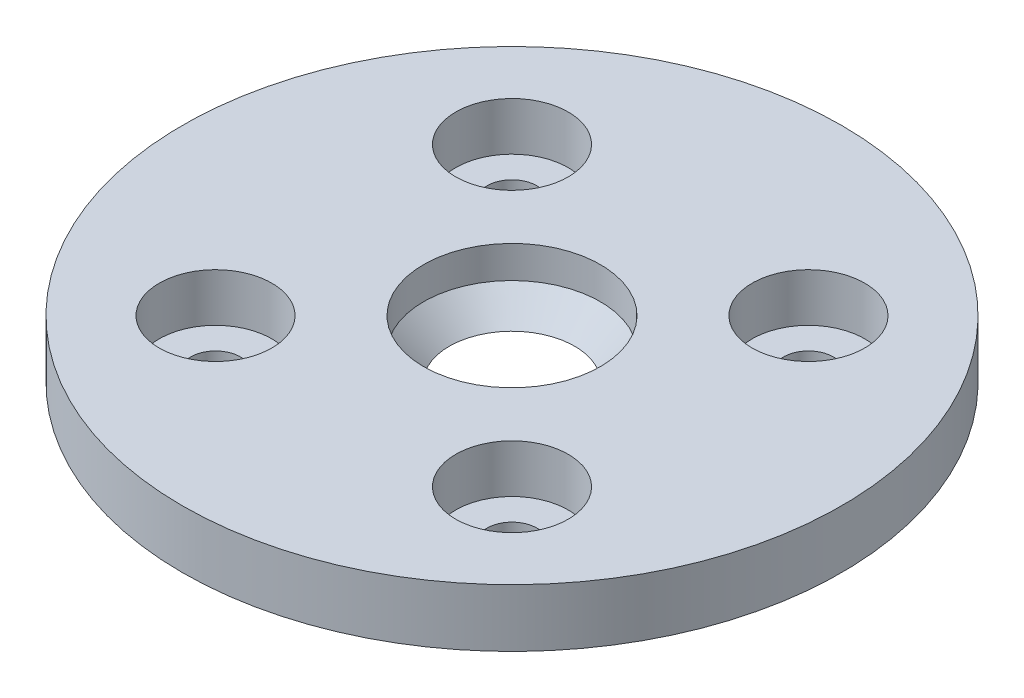
ISO-10303-21;
HEADER;
FILE_DESCRIPTION(('STEP AP214'),'2;1');
FILE_NAME('part.step','',(''),(''),'','','');
FILE_SCHEMA(('AUTOMOTIVE_DESIGN { 1 0 10303 214 1 1 1 1 }'));
ENDSEC;
DATA;
#1=APPLICATION_CONTEXT('core data for automotive mechanical design processes');
#2=APPLICATION_PROTOCOL_DEFINITION('international standard','automotive_design',2000,#1);
#3=PRODUCT_CONTEXT('',#1,'mechanical');
#4=PRODUCT('Part','Part','',(#3));
#5=PRODUCT_RELATED_PRODUCT_CATEGORY('part','',(#4));
#6=PRODUCT_DEFINITION_FORMATION('','',#4);
#7=PRODUCT_DEFINITION_CONTEXT('part definition',#1,'design');
#8=PRODUCT_DEFINITION('design','',#6,#7);
#9=PRODUCT_DEFINITION_SHAPE('','',#8);
#10=(LENGTH_UNIT() NAMED_UNIT(*) SI_UNIT(.MILLI.,.METRE.));
#11=(NAMED_UNIT(*) PLANE_ANGLE_UNIT() SI_UNIT($,.RADIAN.));
#12=(NAMED_UNIT(*) SI_UNIT($,.STERADIAN.) SOLID_ANGLE_UNIT());
#13=UNCERTAINTY_MEASURE_WITH_UNIT(LENGTH_MEASURE(1.E-05),#10,'distance_accuracy_value','');
#14=(GEOMETRIC_REPRESENTATION_CONTEXT(3) GLOBAL_UNCERTAINTY_ASSIGNED_CONTEXT((#13)) GLOBAL_UNIT_ASSIGNED_CONTEXT((#10,
#11,#12)) REPRESENTATION_CONTEXT('',''));
#15=CARTESIAN_POINT('',(0.,0.,0.));
#16=DIRECTION('',(0.,0.,1.));
#17=DIRECTION('',(1.,0.,0.));
#18=AXIS2_PLACEMENT_3D('',#15,#16,#17);
#19=CARTESIAN_POINT('',(0.,0.8,0.));
#20=DIRECTION('',(0.,-1.,0.));
#21=DIRECTION('',(0.,0.,-1.));
#22=AXIS2_PLACEMENT_3D('',#19,#20,#21);
#23=CYLINDRICAL_SURFACE('',#22,10.25);
#24=CARTESIAN_POINT('',(0.,0.,0.));
#25=DIRECTION('',(0.,1.,0.));
#26=DIRECTION('',(0.,0.,1.));
#27=AXIS2_PLACEMENT_3D('',#24,#25,#26);
#28=CIRCLE('',#27,10.25);
#29=CARTESIAN_POINT('',(0.,0.,10.25));
#30=VERTEX_POINT('',#29);
#31=EDGE_CURVE('E11',#30,#30,#28,.T.);
#32=ORIENTED_EDGE('',*,*,#31,.T.);
#33=EDGE_LOOP('',(#32));
#34=FACE_BOUND('',#33,.T.);
#35=CARTESIAN_POINT('',(0.,1.8,0.));
#36=DIRECTION('',(0.,1.,0.));
#37=DIRECTION('',(0.,0.,1.));
#38=AXIS2_PLACEMENT_3D('',#35,#36,#37);
#39=CIRCLE('',#38,10.25);
#40=CARTESIAN_POINT('',(0.,1.8,10.25));
#41=VERTEX_POINT('',#40);
#42=EDGE_CURVE('E300',#41,#41,#39,.T.);
#43=ORIENTED_EDGE('',*,*,#42,.F.);
#44=EDGE_LOOP('',(#43));
#45=FACE_BOUND('',#44,.T.);
#46=ADVANCED_FACE('F36',(#34,#45),#23,.T.);
#47=CARTESIAN_POINT('',(0.,0.,0.));
#48=DIRECTION('',(0.,1.,0.));
#49=DIRECTION('',(0.,0.,1.));
#50=AXIS2_PLACEMENT_3D('',#47,#48,#49);
#51=PLANE('',#50);
#52=DIRECTION('',(0.422618261740701,0.,0.906307787036649));
#53=VECTOR('',#52,1.);
#54=CARTESIAN_POINT('',(2.32440043957385,0.,4.98469282870157));
#55=LINE('',#54,#53);
#56=CARTESIAN_POINT('',(2.32440043957385,0.,4.98469282870157));
#57=VERTEX_POINT('',#56);
#58=CARTESIAN_POINT('',(3.80356435566631,0.,8.15677008332985));
#59=VERTEX_POINT('',#58);
#60=EDGE_CURVE('E179',#57,#59,#55,.T.);
#61=ORIENTED_EDGE('',*,*,#60,.F.);
#62=CARTESIAN_POINT('',(0.,0.,0.));
#63=DIRECTION('',(0.,1.,0.));
#64=DIRECTION('',(0.,0.,-1.));
#65=AXIS2_PLACEMENT_3D('',#62,#63,#64);
#66=CIRCLE('',#65,5.5);
#67=CARTESIAN_POINT('',(-2.32440043957382,0.,4.98469282870159));
#68=VERTEX_POINT('',#67);
#69=EDGE_CURVE('E52',#68,#57,#66,.T.);
#70=ORIENTED_EDGE('',*,*,#69,.F.);
#71=DIRECTION('',(0.422618261740694,0.,-0.906307787036652));
#72=VECTOR('',#71,1.);
#73=CARTESIAN_POINT('',(-2.32440043957382,0.,4.98469282870159));
#74=LINE('',#73,#72);
#75=CARTESIAN_POINT('',(-3.80356435566625,0.,8.15677008332987));
#76=VERTEX_POINT('',#75);
#77=EDGE_CURVE('E170',#76,#68,#74,.T.);
#78=ORIENTED_EDGE('',*,*,#77,.F.);
#79=CARTESIAN_POINT('',(0.,0.,0.));
#80=DIRECTION('',(0.,-1.,0.));
#81=DIRECTION('',(0.,0.,-1.));
#82=AXIS2_PLACEMENT_3D('',#79,#80,#81);
#83=CIRCLE('',#82,9.);
#84=EDGE_CURVE('E173',#59,#76,#83,.T.);
#85=ORIENTED_EDGE('',*,*,#84,.F.);
#86=EDGE_LOOP('',(#61,#70,#78,#85));
#87=FACE_BOUND('',#86,.T.);
#88=DIRECTION('',(-0.90630778703665,0.,0.4226182617407));
#89=VECTOR('',#88,1.);
#90=CARTESIAN_POINT('',(-4.98469282870157,0.,2.32440043957385));
#91=LINE('',#90,#89);
#92=CARTESIAN_POINT('',(-4.98469282870157,0.,2.32440043957385));
#93=VERTEX_POINT('',#92);
#94=CARTESIAN_POINT('',(-8.15677008332985,0.,3.8035643556663));
#95=VERTEX_POINT('',#94);
#96=EDGE_CURVE('E205',#93,#95,#91,.T.);
#97=ORIENTED_EDGE('',*,*,#96,.F.);
#98=CARTESIAN_POINT('',(0.,0.,0.));
#99=DIRECTION('',(0.,1.,0.));
#100=DIRECTION('',(0.,0.,-1.));
#101=AXIS2_PLACEMENT_3D('',#98,#99,#100);
#102=CIRCLE('',#101,5.5);
#103=CARTESIAN_POINT('',(-4.98469282870159,0.,-2.32440043957381));
#104=VERTEX_POINT('',#103);
#105=EDGE_CURVE('E60',#104,#93,#102,.T.);
#106=ORIENTED_EDGE('',*,*,#105,.F.);
#107=DIRECTION('',(0.906307787036653,0.,0.422618261740692));
#108=VECTOR('',#107,1.);
#109=CARTESIAN_POINT('',(-4.98469282870159,0.,-2.32440043957381));
#110=LINE('',#109,#108);
#111=CARTESIAN_POINT('',(-8.15677008332988,0.,-3.80356435566623));
#112=VERTEX_POINT('',#111);
#113=EDGE_CURVE('E194',#112,#104,#110,.T.);
#114=ORIENTED_EDGE('',*,*,#113,.F.);
#115=CARTESIAN_POINT('',(0.,0.,0.));
#116=DIRECTION('',(0.,-1.,0.));
#117=DIRECTION('',(0.,0.,-1.));
#118=AXIS2_PLACEMENT_3D('',#115,#116,#117);
#119=CIRCLE('',#118,9.);
#120=EDGE_CURVE('E209',#95,#112,#119,.T.);
#121=ORIENTED_EDGE('',*,*,#120,.F.);
#122=EDGE_LOOP('',(#97,#106,#114,#121));
#123=FACE_BOUND('',#122,.T.);
#124=DIRECTION('',(-0.422618261740693,0.,0.906307787036653));
#125=VECTOR('',#124,1.);
#126=CARTESIAN_POINT('',(2.32440043957381,0.,-4.98469282870159));
#127=LINE('',#126,#125);
#128=CARTESIAN_POINT('',(3.80356435566623,0.,-8.15677008332988));
#129=VERTEX_POINT('',#128);
#130=CARTESIAN_POINT('',(2.32440043957381,0.,-4.98469282870159));
#131=VERTEX_POINT('',#130);
#132=EDGE_CURVE('E236',#129,#131,#127,.T.);
#133=ORIENTED_EDGE('',*,*,#132,.F.);
#134=CARTESIAN_POINT('',(0.,0.,0.));
#135=DIRECTION('',(0.,-1.,0.));
#136=DIRECTION('',(0.,0.,-1.));
#137=AXIS2_PLACEMENT_3D('',#134,#135,#136);
#138=CIRCLE('',#137,9.);
#139=CARTESIAN_POINT('',(-3.8035643556663,0.,-8.15677008332985));
#140=VERTEX_POINT('',#139);
#141=EDGE_CURVE('E234',#140,#129,#138,.T.);
#142=ORIENTED_EDGE('',*,*,#141,.F.);
#143=DIRECTION('',(-0.4226182617407,0.,-0.90630778703665));
#144=VECTOR('',#143,1.);
#145=CARTESIAN_POINT('',(-2.32440043957385,0.,-4.98469282870157));
#146=LINE('',#145,#144);
#147=CARTESIAN_POINT('',(-2.32440043957385,0.,-4.98469282870157));
#148=VERTEX_POINT('',#147);
#149=EDGE_CURVE('E224',#148,#140,#146,.T.);
#150=ORIENTED_EDGE('',*,*,#149,.F.);
#151=CARTESIAN_POINT('',(0.,0.,0.));
#152=DIRECTION('',(0.,1.,0.));
#153=DIRECTION('',(0.,0.,-1.));
#154=AXIS2_PLACEMENT_3D('',#151,#152,#153);
#155=CIRCLE('',#154,5.5);
#156=EDGE_CURVE('E240',#131,#148,#155,.T.);
#157=ORIENTED_EDGE('',*,*,#156,.F.);
#158=EDGE_LOOP('',(#133,#142,#150,#157));
#159=FACE_BOUND('',#158,.T.);
#160=DIRECTION('',(-0.906307787036653,0.,-0.422618261740693));
#161=VECTOR('',#160,1.);
#162=CARTESIAN_POINT('',(4.98469282870159,0.,2.32440043957381));
#163=LINE('',#162,#161);
#164=CARTESIAN_POINT('',(8.15677008332987,0.,3.80356435566624));
#165=VERTEX_POINT('',#164);
#166=CARTESIAN_POINT('',(4.98469282870159,0.,2.32440043957381));
#167=VERTEX_POINT('',#166);
#168=EDGE_CURVE('E268',#165,#167,#163,.T.);
#169=ORIENTED_EDGE('',*,*,#168,.F.);
#170=CARTESIAN_POINT('',(0.,0.,0.));
#171=DIRECTION('',(0.,-1.,0.));
#172=DIRECTION('',(0.,0.,-1.));
#173=AXIS2_PLACEMENT_3D('',#170,#171,#172);
#174=CIRCLE('',#173,9.);
#175=CARTESIAN_POINT('',(8.15677008332985,0.,-3.80356435566629));
#176=VERTEX_POINT('',#175);
#177=EDGE_CURVE('E266',#176,#165,#174,.T.);
#178=ORIENTED_EDGE('',*,*,#177,.F.);
#179=DIRECTION('',(0.90630778703665,0.,-0.422618261740699));
#180=VECTOR('',#179,1.);
#181=CARTESIAN_POINT('',(4.98469282870157,0.,-2.32440043957384));
#182=LINE('',#181,#180);
#183=CARTESIAN_POINT('',(4.98469282870158,0.,-2.32440043957384));
#184=VERTEX_POINT('',#183);
#185=EDGE_CURVE('E256',#184,#176,#182,.T.);
#186=ORIENTED_EDGE('',*,*,#185,.F.);
#187=CARTESIAN_POINT('',(0.,0.,0.));
#188=DIRECTION('',(0.,1.,0.));
#189=DIRECTION('',(0.,0.,-1.));
#190=AXIS2_PLACEMENT_3D('',#187,#188,#189);
#191=CIRCLE('',#190,5.5);
#192=EDGE_CURVE('E271',#167,#184,#191,.T.);
#193=ORIENTED_EDGE('',*,*,#192,.F.);
#194=EDGE_LOOP('',(#169,#178,#186,#193));
#195=FACE_BOUND('',#194,.T.);
#196=CARTESIAN_POINT('',(-4.61033621333629,0.,-4.61033621333629));
#197=DIRECTION('',(0.,1.,0.));
#198=DIRECTION('',(0.,0.,1.));
#199=AXIS2_PLACEMENT_3D('',#196,#197,#198);
#200=CIRCLE('',#199,0.775);
#201=CARTESIAN_POINT('',(-4.61033621333629,0.,-3.83533621333629));
#202=VERTEX_POINT('',#201);
#203=EDGE_CURVE('E39',#202,#202,#200,.T.);
#204=ORIENTED_EDGE('',*,*,#203,.T.);
#205=EDGE_LOOP('',(#204));
#206=FACE_BOUND('',#205,.T.);
#207=CARTESIAN_POINT('',(4.61033621333629,0.,4.61033621333629));
#208=DIRECTION('',(0.,1.,0.));
#209=DIRECTION('',(0.,0.,1.));
#210=AXIS2_PLACEMENT_3D('',#207,#208,#209);
#211=CIRCLE('',#210,0.775);
#212=CARTESIAN_POINT('',(4.61033621333629,0.,5.38533621333629));
#213=VERTEX_POINT('',#212);
#214=EDGE_CURVE('E334',#213,#213,#211,.T.);
#215=ORIENTED_EDGE('',*,*,#214,.T.);
#216=EDGE_LOOP('',(#215));
#217=FACE_BOUND('',#216,.T.);
#218=CARTESIAN_POINT('',(4.61033621333629,0.,-4.61033621333629));
#219=DIRECTION('',(0.,1.,0.));
#220=DIRECTION('',(0.,0.,1.));
#221=AXIS2_PLACEMENT_3D('',#218,#219,#220);
#222=CIRCLE('',#221,0.775);
#223=CARTESIAN_POINT('',(4.61033621333629,0.,-3.83533621333629));
#224=VERTEX_POINT('',#223);
#225=EDGE_CURVE('E332',#224,#224,#222,.T.);
#226=ORIENTED_EDGE('',*,*,#225,.T.);
#227=EDGE_LOOP('',(#226));
#228=FACE_BOUND('',#227,.T.);
#229=CARTESIAN_POINT('',(-4.61033621333629,0.,4.61033621333629));
#230=DIRECTION('',(0.,1.,0.));
#231=DIRECTION('',(0.,0.,1.));
#232=AXIS2_PLACEMENT_3D('',#229,#230,#231);
#233=CIRCLE('',#232,0.775);
#234=CARTESIAN_POINT('',(-4.61033621333629,0.,5.38533621333629));
#235=VERTEX_POINT('',#234);
#236=EDGE_CURVE('E315',#235,#235,#233,.T.);
#237=ORIENTED_EDGE('',*,*,#236,.T.);
#238=EDGE_LOOP('',(#237));
#239=FACE_BOUND('',#238,.T.);
#240=CARTESIAN_POINT('',(0.,0.,0.));
#241=DIRECTION('',(0.,1.,0.));
#242=DIRECTION('',(0.,0.,1.));
#243=AXIS2_PLACEMENT_3D('',#240,#241,#242);
#244=CIRCLE('',#243,1.95);
#245=CARTESIAN_POINT('',(0.,0.,1.95));
#246=VERTEX_POINT('',#245);
#247=EDGE_CURVE('E44',#246,#246,#244,.T.);
#248=ORIENTED_EDGE('',*,*,#247,.T.);
#249=EDGE_LOOP('',(#248));
#250=FACE_BOUND('',#249,.T.);
#251=ORIENTED_EDGE('',*,*,#31,.F.);
#252=EDGE_LOOP('',(#251));
#253=FACE_BOUND('',#252,.T.);
#254=ADVANCED_FACE('F341',(#87,#123,#159,#195,#206,#217,#228,#239,#250,#253),#51,.F.);
#255=CARTESIAN_POINT('',(0.,0.8,0.));
#256=DIRECTION('',(0.,1.,0.));
#257=DIRECTION('',(0.,0.,1.));
#258=AXIS2_PLACEMENT_3D('',#255,#256,#257);
#259=CONICAL_SURFACE('',#258,2.75,0.785398163397449);
#260=CARTESIAN_POINT('',(0.,0.8,0.));
#261=DIRECTION('',(0.,1.,0.));
#262=DIRECTION('',(0.,0.,1.));
#263=AXIS2_PLACEMENT_3D('',#260,#261,#262);
#264=CIRCLE('',#263,2.75);
#265=CARTESIAN_POINT('',(0.,0.8,2.75));
#266=VERTEX_POINT('',#265);
#267=EDGE_CURVE('E291',#266,#266,#264,.T.);
#268=ORIENTED_EDGE('',*,*,#267,.T.);
#269=EDGE_LOOP('',(#268));
#270=FACE_BOUND('',#269,.T.);
#271=ORIENTED_EDGE('',*,*,#247,.F.);
#272=EDGE_LOOP('',(#271));
#273=FACE_BOUND('',#272,.T.);
#274=ADVANCED_FACE('F365',(#270,#273),#259,.F.);
#275=CARTESIAN_POINT('',(-4.61033621333629,0.3,4.61033621333629));
#276=DIRECTION('',(0.,1.,0.));
#277=DIRECTION('',(0.,0.,1.));
#278=AXIS2_PLACEMENT_3D('',#275,#276,#277);
#279=CYLINDRICAL_SURFACE('',#278,1.75);
#280=CARTESIAN_POINT('',(-4.61033621333629,0.3,4.61033621333629));
#281=DIRECTION('',(0.,1.,0.));
#282=DIRECTION('',(0.,0.,1.));
#283=AXIS2_PLACEMENT_3D('',#280,#281,#282);
#284=CIRCLE('',#283,1.75);
#285=CARTESIAN_POINT('',(-4.61033621333629,0.3,6.36033621333629));
#286=VERTEX_POINT('',#285);
#287=EDGE_CURVE('E319',#286,#286,#284,.T.);
#288=ORIENTED_EDGE('',*,*,#287,.F.);
#289=EDGE_LOOP('',(#288));
#290=FACE_BOUND('',#289,.T.);
#291=CARTESIAN_POINT('',(-4.61033621333629,1.8,4.61033621333629));
#292=DIRECTION('',(0.,1.,0.));
#293=DIRECTION('',(0.,0.,1.));
#294=AXIS2_PLACEMENT_3D('',#291,#292,#293);
#295=CIRCLE('',#294,1.75);
#296=CARTESIAN_POINT('',(-4.61033621333629,1.8,6.36033621333629));
#297=VERTEX_POINT('',#296);
#298=EDGE_CURVE('E288',#297,#297,#295,.T.);
#299=ORIENTED_EDGE('',*,*,#298,.T.);
#300=EDGE_LOOP('',(#299));
#301=FACE_BOUND('',#300,.T.);
#302=ADVANCED_FACE('F401',(#290,#301),#279,.F.);
#303=CARTESIAN_POINT('',(-4.61033621333629,0.3,4.61033621333629));
#304=DIRECTION('',(0.,1.,0.));
#305=DIRECTION('',(0.,0.,1.));
#306=AXIS2_PLACEMENT_3D('',#303,#304,#305);
#307=PLANE('',#306);
#308=CARTESIAN_POINT('',(-4.61033621333629,0.3,4.61033621333629));
#309=DIRECTION('',(0.,1.,0.));
#310=DIRECTION('',(0.,0.,1.));
#311=AXIS2_PLACEMENT_3D('',#308,#309,#310);
#312=CIRCLE('',#311,0.775);
#313=CARTESIAN_POINT('',(-4.61033621333629,0.3,5.38533621333629));
#314=VERTEX_POINT('',#313);
#315=EDGE_CURVE('E307',#314,#314,#312,.T.);
#316=ORIENTED_EDGE('',*,*,#315,.F.);
#317=EDGE_LOOP('',(#316));
#318=FACE_BOUND('',#317,.T.);
#319=ORIENTED_EDGE('',*,*,#287,.T.);
#320=EDGE_LOOP('',(#319));
#321=FACE_BOUND('',#320,.T.);
#322=ADVANCED_FACE('F397',(#318,#321),#307,.T.);
#323=CARTESIAN_POINT('',(4.61033621333629,0.3,-4.61033621333629));
#324=DIRECTION('',(0.,1.,0.));
#325=DIRECTION('',(0.,0.,1.));
#326=AXIS2_PLACEMENT_3D('',#323,#324,#325);
#327=CYLINDRICAL_SURFACE('',#326,1.75);
#328=CARTESIAN_POINT('',(4.61033621333629,0.3,-4.61033621333629));
#329=DIRECTION('',(0.,1.,0.));
#330=DIRECTION('',(0.,0.,1.));
#331=AXIS2_PLACEMENT_3D('',#328,#329,#330);
#332=CIRCLE('',#331,1.75);
#333=CARTESIAN_POINT('',(4.61033621333629,0.3,-2.86033621333629));
#334=VERTEX_POINT('',#333);
#335=EDGE_CURVE('E316',#334,#334,#332,.T.);
#336=ORIENTED_EDGE('',*,*,#335,.F.);
#337=EDGE_LOOP('',(#336));
#338=FACE_BOUND('',#337,.T.);
#339=CARTESIAN_POINT('',(4.61033621333629,1.8,-4.61033621333629));
#340=DIRECTION('',(0.,1.,0.));
#341=DIRECTION('',(0.,0.,1.));
#342=AXIS2_PLACEMENT_3D('',#339,#340,#341);
#343=CIRCLE('',#342,1.75);
#344=CARTESIAN_POINT('',(4.61033621333629,1.8,-2.86033621333629));
#345=VERTEX_POINT('',#344);
#346=EDGE_CURVE('E295',#345,#345,#343,.T.);
#347=ORIENTED_EDGE('',*,*,#346,.T.);
#348=EDGE_LOOP('',(#347));
#349=FACE_BOUND('',#348,.T.);
#350=ADVANCED_FACE('F400',(#338,#349),#327,.F.);
#351=CARTESIAN_POINT('',(4.61033621333629,0.3,-4.61033621333629));
#352=DIRECTION('',(0.,1.,0.));
#353=DIRECTION('',(0.,0.,1.));
#354=AXIS2_PLACEMENT_3D('',#351,#352,#353);
#355=PLANE('',#354);
#356=CARTESIAN_POINT('',(4.61033621333629,0.3,-4.61033621333629));
#357=DIRECTION('',(0.,1.,0.));
#358=DIRECTION('',(0.,0.,1.));
#359=AXIS2_PLACEMENT_3D('',#356,#357,#358);
#360=CIRCLE('',#359,0.775);
#361=CARTESIAN_POINT('',(4.61033621333629,0.3,-3.83533621333629));
#362=VERTEX_POINT('',#361);
#363=EDGE_CURVE('E304',#362,#362,#360,.T.);
#364=ORIENTED_EDGE('',*,*,#363,.F.);
#365=EDGE_LOOP('',(#364));
#366=FACE_BOUND('',#365,.T.);
#367=ORIENTED_EDGE('',*,*,#335,.T.);
#368=EDGE_LOOP('',(#367));
#369=FACE_BOUND('',#368,.T.);
#370=ADVANCED_FACE('F442',(#366,#369),#355,.T.);
#371=CARTESIAN_POINT('',(4.61033621333629,0.3,4.61033621333629));
#372=DIRECTION('',(0.,1.,0.));
#373=DIRECTION('',(0.,0.,1.));
#374=AXIS2_PLACEMENT_3D('',#371,#372,#373);
#375=CYLINDRICAL_SURFACE('',#374,1.75);
#376=CARTESIAN_POINT('',(4.61033621333629,0.3,4.61033621333629));
#377=DIRECTION('',(0.,1.,0.));
#378=DIRECTION('',(0.,0.,1.));
#379=AXIS2_PLACEMENT_3D('',#376,#377,#378);
#380=CIRCLE('',#379,1.75);
#381=CARTESIAN_POINT('',(4.61033621333629,0.3,6.36033621333629));
#382=VERTEX_POINT('',#381);
#383=EDGE_CURVE('E320',#382,#382,#380,.T.);
#384=ORIENTED_EDGE('',*,*,#383,.F.);
#385=EDGE_LOOP('',(#384));
#386=FACE_BOUND('',#385,.T.);
#387=CARTESIAN_POINT('',(4.61033621333629,1.8,4.61033621333629));
#388=DIRECTION('',(0.,1.,0.));
#389=DIRECTION('',(0.,0.,1.));
#390=AXIS2_PLACEMENT_3D('',#387,#388,#389);
#391=CIRCLE('',#390,1.75);
#392=CARTESIAN_POINT('',(4.61033621333629,1.8,6.36033621333629));
#393=VERTEX_POINT('',#392);
#394=EDGE_CURVE('E285',#393,#393,#391,.T.);
#395=ORIENTED_EDGE('',*,*,#394,.T.);
#396=EDGE_LOOP('',(#395));
#397=FACE_BOUND('',#396,.T.);
#398=ADVANCED_FACE('F391',(#386,#397),#375,.F.);
#399=CARTESIAN_POINT('',(4.61033621333629,0.3,4.61033621333629));
#400=DIRECTION('',(0.,1.,0.));
#401=DIRECTION('',(0.,0.,1.));
#402=AXIS2_PLACEMENT_3D('',#399,#400,#401);
#403=PLANE('',#402);
#404=CARTESIAN_POINT('',(4.61033621333629,0.3,4.61033621333629));
#405=DIRECTION('',(0.,1.,0.));
#406=DIRECTION('',(0.,0.,1.));
#407=AXIS2_PLACEMENT_3D('',#404,#405,#406);
#408=CIRCLE('',#407,0.775);
#409=CARTESIAN_POINT('',(4.61033621333629,0.3,5.38533621333629));
#410=VERTEX_POINT('',#409);
#411=EDGE_CURVE('E308',#410,#410,#408,.T.);
#412=ORIENTED_EDGE('',*,*,#411,.F.);
#413=EDGE_LOOP('',(#412));
#414=FACE_BOUND('',#413,.T.);
#415=ORIENTED_EDGE('',*,*,#383,.T.);
#416=EDGE_LOOP('',(#415));
#417=FACE_BOUND('',#416,.T.);
#418=ADVANCED_FACE('F381',(#414,#417),#403,.T.);
#419=CARTESIAN_POINT('',(-4.61033621333629,0.3,-4.61033621333629));
#420=DIRECTION('',(0.,1.,0.));
#421=DIRECTION('',(0.,0.,1.));
#422=AXIS2_PLACEMENT_3D('',#419,#420,#421);
#423=CYLINDRICAL_SURFACE('',#422,1.75);
#424=CARTESIAN_POINT('',(-4.61033621333629,0.3,-4.61033621333629));
#425=DIRECTION('',(0.,1.,0.));
#426=DIRECTION('',(0.,0.,1.));
#427=AXIS2_PLACEMENT_3D('',#424,#425,#426);
#428=CIRCLE('',#427,1.75);
#429=CARTESIAN_POINT('',(-4.61033621333629,0.3,-2.86033621333629));
#430=VERTEX_POINT('',#429);
#431=EDGE_CURVE('E323',#430,#430,#428,.T.);
#432=ORIENTED_EDGE('',*,*,#431,.F.);
#433=EDGE_LOOP('',(#432));
#434=FACE_BOUND('',#433,.T.);
#435=CARTESIAN_POINT('',(-4.61033621333629,1.8,-4.61033621333629));
#436=DIRECTION('',(0.,1.,0.));
#437=DIRECTION('',(0.,0.,1.));
#438=AXIS2_PLACEMENT_3D('',#435,#436,#437);
#439=CIRCLE('',#438,1.75);
#440=CARTESIAN_POINT('',(-4.61033621333629,1.8,-2.86033621333629));
#441=VERTEX_POINT('',#440);
#442=EDGE_CURVE('E186',#441,#441,#439,.T.);
#443=ORIENTED_EDGE('',*,*,#442,.T.);
#444=EDGE_LOOP('',(#443));
#445=FACE_BOUND('',#444,.T.);
#446=ADVANCED_FACE('F378',(#434,#445),#423,.F.);
#447=CARTESIAN_POINT('',(-4.61033621333629,0.3,-4.61033621333629));
#448=DIRECTION('',(0.,1.,0.));
#449=DIRECTION('',(0.,0.,1.));
#450=AXIS2_PLACEMENT_3D('',#447,#448,#449);
#451=PLANE('',#450);
#452=CARTESIAN_POINT('',(-4.61033621333629,0.3,-4.61033621333629));
#453=DIRECTION('',(0.,1.,0.));
#454=DIRECTION('',(0.,0.,1.));
#455=AXIS2_PLACEMENT_3D('',#452,#453,#454);
#456=CIRCLE('',#455,0.775);
#457=CARTESIAN_POINT('',(-4.61033621333629,0.3,-3.83533621333629));
#458=VERTEX_POINT('',#457);
#459=EDGE_CURVE('E303',#458,#458,#456,.T.);
#460=ORIENTED_EDGE('',*,*,#459,.F.);
#461=EDGE_LOOP('',(#460));
#462=FACE_BOUND('',#461,.T.);
#463=ORIENTED_EDGE('',*,*,#431,.T.);
#464=EDGE_LOOP('',(#463));
#465=FACE_BOUND('',#464,.T.);
#466=ADVANCED_FACE('F380',(#462,#465),#451,.T.);
#467=CARTESIAN_POINT('',(-4.61033621333629,-0.2,4.61033621333629));
#468=DIRECTION('',(0.,1.,0.));
#469=DIRECTION('',(0.,0.,1.));
#470=AXIS2_PLACEMENT_3D('',#467,#468,#469);
#471=CYLINDRICAL_SURFACE('',#470,0.775);
#472=ORIENTED_EDGE('',*,*,#315,.T.);
#473=EDGE_LOOP('',(#472));
#474=FACE_BOUND('',#473,.T.);
#475=ORIENTED_EDGE('',*,*,#236,.F.);
#476=EDGE_LOOP('',(#475));
#477=FACE_BOUND('',#476,.T.);
#478=ADVANCED_FACE('F388',(#474,#477),#471,.F.);
#479=CARTESIAN_POINT('',(4.61033621333629,-0.2,-4.61033621333629));
#480=DIRECTION('',(0.,1.,0.));
#481=DIRECTION('',(0.,0.,1.));
#482=AXIS2_PLACEMENT_3D('',#479,#480,#481);
#483=CYLINDRICAL_SURFACE('',#482,0.775);
#484=ORIENTED_EDGE('',*,*,#363,.T.);
#485=EDGE_LOOP('',(#484));
#486=FACE_BOUND('',#485,.T.);
#487=ORIENTED_EDGE('',*,*,#225,.F.);
#488=EDGE_LOOP('',(#487));
#489=FACE_BOUND('',#488,.T.);
#490=ADVANCED_FACE('F356',(#486,#489),#483,.F.);
#491=CARTESIAN_POINT('',(4.61033621333629,-0.2,4.61033621333629));
#492=DIRECTION('',(0.,1.,0.));
#493=DIRECTION('',(0.,0.,1.));
#494=AXIS2_PLACEMENT_3D('',#491,#492,#493);
#495=CYLINDRICAL_SURFACE('',#494,0.775);
#496=ORIENTED_EDGE('',*,*,#411,.T.);
#497=EDGE_LOOP('',(#496));
#498=FACE_BOUND('',#497,.T.);
#499=ORIENTED_EDGE('',*,*,#214,.F.);
#500=EDGE_LOOP('',(#499));
#501=FACE_BOUND('',#500,.T.);
#502=ADVANCED_FACE('F346',(#498,#501),#495,.F.);
#503=CARTESIAN_POINT('',(-4.61033621333629,-0.2,-4.61033621333629));
#504=DIRECTION('',(0.,1.,0.));
#505=DIRECTION('',(0.,0.,1.));
#506=AXIS2_PLACEMENT_3D('',#503,#504,#505);
#507=CYLINDRICAL_SURFACE('',#506,0.775);
#508=ORIENTED_EDGE('',*,*,#459,.T.);
#509=EDGE_LOOP('',(#508));
#510=FACE_BOUND('',#509,.T.);
#511=ORIENTED_EDGE('',*,*,#203,.F.);
#512=EDGE_LOOP('',(#511));
#513=FACE_BOUND('',#512,.T.);
#514=ADVANCED_FACE('F343',(#510,#513),#507,.F.);
#515=CARTESIAN_POINT('',(0.,1.8,0.));
#516=DIRECTION('',(0.,1.,0.));
#517=DIRECTION('',(0.,0.,1.));
#518=AXIS2_PLACEMENT_3D('',#515,#516,#517);
#519=PLANE('',#518);
#520=ORIENTED_EDGE('',*,*,#394,.F.);
#521=EDGE_LOOP('',(#520));
#522=FACE_BOUND('',#521,.T.);
#523=CARTESIAN_POINT('',(0.,1.8,0.));
#524=DIRECTION('',(0.,1.,0.));
#525=DIRECTION('',(0.,0.,1.));
#526=AXIS2_PLACEMENT_3D('',#523,#524,#525);
#527=CIRCLE('',#526,2.75);
#528=CARTESIAN_POINT('',(0.,1.8,2.75));
#529=VERTEX_POINT('',#528);
#530=EDGE_CURVE('E292',#529,#529,#527,.T.);
#531=ORIENTED_EDGE('',*,*,#530,.F.);
#532=EDGE_LOOP('',(#531));
#533=FACE_BOUND('',#532,.T.);
#534=ORIENTED_EDGE('',*,*,#42,.T.);
#535=EDGE_LOOP('',(#534));
#536=FACE_BOUND('',#535,.T.);
#537=ORIENTED_EDGE('',*,*,#346,.F.);
#538=EDGE_LOOP('',(#537));
#539=FACE_BOUND('',#538,.T.);
#540=ORIENTED_EDGE('',*,*,#298,.F.);
#541=EDGE_LOOP('',(#540));
#542=FACE_BOUND('',#541,.T.);
#543=ORIENTED_EDGE('',*,*,#442,.F.);
#544=EDGE_LOOP('',(#543));
#545=FACE_BOUND('',#544,.T.);
#546=ADVANCED_FACE('F345',(#522,#533,#536,#539,#542,#545),#519,.T.);
#547=CARTESIAN_POINT('',(0.,1.8,0.));
#548=DIRECTION('',(0.,-1.,0.));
#549=DIRECTION('',(0.,0.,-1.));
#550=AXIS2_PLACEMENT_3D('',#547,#548,#549);
#551=CYLINDRICAL_SURFACE('',#550,2.75);
#552=ORIENTED_EDGE('',*,*,#530,.T.);
#553=EDGE_LOOP('',(#552));
#554=FACE_BOUND('',#553,.T.);
#555=ORIENTED_EDGE('',*,*,#267,.F.);
#556=EDGE_LOOP('',(#555));
#557=FACE_BOUND('',#556,.T.);
#558=ADVANCED_FACE('F353',(#554,#557),#551,.F.);
#559=CARTESIAN_POINT('',(0.,1.,0.));
#560=DIRECTION('',(0.,-1.,0.));
#561=DIRECTION('',(0.,0.,-1.));
#562=AXIS2_PLACEMENT_3D('',#559,#560,#561);
#563=CYLINDRICAL_SURFACE('',#562,5.5);
#564=ORIENTED_EDGE('',*,*,#69,.T.);
#565=DIRECTION('',(0.,-1.,0.));
#566=VECTOR('',#565,1.);
#567=CARTESIAN_POINT('',(2.32440043957385,1.,4.98469282870157));
#568=LINE('',#567,#566);
#569=CARTESIAN_POINT('',(2.32440043957385,1.,4.98469282870157));
#570=VERTEX_POINT('',#569);
#571=EDGE_CURVE('E148',#570,#57,#568,.T.);
#572=ORIENTED_EDGE('',*,*,#571,.F.);
#573=CARTESIAN_POINT('',(0.,1.,0.));
#574=DIRECTION('',(0.,1.,0.));
#575=DIRECTION('',(0.,0.,-1.));
#576=AXIS2_PLACEMENT_3D('',#573,#574,#575);
#577=CIRCLE('',#576,5.5);
#578=CARTESIAN_POINT('',(-2.32440043957382,1.,4.98469282870159));
#579=VERTEX_POINT('',#578);
#580=EDGE_CURVE('E152',#579,#570,#577,.T.);
#581=ORIENTED_EDGE('',*,*,#580,.F.);
#582=DIRECTION('',(0.,-1.,0.));
#583=VECTOR('',#582,1.);
#584=CARTESIAN_POINT('',(-2.32440043957382,1.,4.98469282870159));
#585=LINE('',#584,#583);
#586=EDGE_CURVE('E184',#579,#68,#585,.T.);
#587=ORIENTED_EDGE('',*,*,#586,.T.);
#588=EDGE_LOOP('',(#564,#572,#581,#587));
#589=FACE_BOUND('',#588,.T.);
#590=ADVANCED_FACE('F150',(#589),#563,.T.);
#591=CARTESIAN_POINT('',(-2.32440043957382,1.,4.98469282870159));
#592=DIRECTION('',(-0.906307787036653,0.,-0.422618261740694));
#593=DIRECTION('',(-0.422618261740694,0.,0.906307787036653));
#594=AXIS2_PLACEMENT_3D('',#591,#592,#593);
#595=PLANE('',#594);
#596=ORIENTED_EDGE('',*,*,#77,.T.);
#597=ORIENTED_EDGE('',*,*,#586,.F.);
#598=DIRECTION('',(0.422618261740694,0.,-0.906307787036652));
#599=VECTOR('',#598,1.);
#600=CARTESIAN_POINT('',(-2.32440043957382,1.,4.98469282870159));
#601=LINE('',#600,#599);
#602=CARTESIAN_POINT('',(-3.80356435566625,1.,8.15677008332987));
#603=VERTEX_POINT('',#602);
#604=EDGE_CURVE('E158',#603,#579,#601,.T.);
#605=ORIENTED_EDGE('',*,*,#604,.F.);
#606=DIRECTION('',(0.,-1.,0.));
#607=VECTOR('',#606,1.);
#608=CARTESIAN_POINT('',(-3.80356435566625,1.,8.15677008332987));
#609=LINE('',#608,#607);
#610=EDGE_CURVE('E187',#603,#76,#609,.T.);
#611=ORIENTED_EDGE('',*,*,#610,.T.);
#612=EDGE_LOOP('',(#596,#597,#605,#611));
#613=FACE_BOUND('',#612,.T.);
#614=ADVANCED_FACE('F422',(#613),#595,.F.);
#615=CARTESIAN_POINT('',(0.,1.,0.));
#616=DIRECTION('',(0.,-1.,0.));
#617=DIRECTION('',(0.,0.,-1.));
#618=AXIS2_PLACEMENT_3D('',#615,#616,#617);
#619=CYLINDRICAL_SURFACE('',#618,9.);
#620=ORIENTED_EDGE('',*,*,#84,.T.);
#621=ORIENTED_EDGE('',*,*,#610,.F.);
#622=CARTESIAN_POINT('',(0.,1.,0.));
#623=DIRECTION('',(0.,-1.,0.));
#624=DIRECTION('',(0.,0.,-1.));
#625=AXIS2_PLACEMENT_3D('',#622,#623,#624);
#626=CIRCLE('',#625,9.);
#627=CARTESIAN_POINT('',(3.80356435566631,1.,8.15677008332985));
#628=VERTEX_POINT('',#627);
#629=EDGE_CURVE('E166',#628,#603,#626,.T.);
#630=ORIENTED_EDGE('',*,*,#629,.F.);
#631=DIRECTION('',(0.,-1.,0.));
#632=VECTOR('',#631,1.);
#633=CARTESIAN_POINT('',(3.80356435566631,1.,8.15677008332985));
#634=LINE('',#633,#632);
#635=EDGE_CURVE('E157',#628,#59,#634,.T.);
#636=ORIENTED_EDGE('',*,*,#635,.T.);
#637=EDGE_LOOP('',(#620,#621,#630,#636));
#638=FACE_BOUND('',#637,.T.);
#639=ADVANCED_FACE('F596',(#638),#619,.F.);
#640=CARTESIAN_POINT('',(2.32440043957385,1.,4.98469282870157));
#641=DIRECTION('',(0.906307787036649,0.,-0.422618261740701));
#642=DIRECTION('',(-0.422618261740701,0.,-0.906307787036649));
#643=AXIS2_PLACEMENT_3D('',#640,#641,#642);
#644=PLANE('',#643);
#645=ORIENTED_EDGE('',*,*,#60,.T.);
#646=ORIENTED_EDGE('',*,*,#635,.F.);
#647=DIRECTION('',(0.422618261740701,0.,0.906307787036649));
#648=VECTOR('',#647,1.);
#649=CARTESIAN_POINT('',(2.32440043957385,1.,4.98469282870157));
#650=LINE('',#649,#648);
#651=EDGE_CURVE('E161',#570,#628,#650,.T.);
#652=ORIENTED_EDGE('',*,*,#651,.F.);
#653=ORIENTED_EDGE('',*,*,#571,.T.);
#654=EDGE_LOOP('',(#645,#646,#652,#653));
#655=FACE_BOUND('',#654,.T.);
#656=ADVANCED_FACE('F162',(#655),#644,.F.);
#657=CARTESIAN_POINT('',(0.,1.,0.));
#658=DIRECTION('',(0.,-1.,0.));
#659=DIRECTION('',(0.,0.,-1.));
#660=AXIS2_PLACEMENT_3D('',#657,#658,#659);
#661=CYLINDRICAL_SURFACE('',#660,5.5);
#662=ORIENTED_EDGE('',*,*,#105,.T.);
#663=DIRECTION('',(0.,-1.,0.));
#664=VECTOR('',#663,1.);
#665=CARTESIAN_POINT('',(-4.98469282870157,1.,2.32440043957385));
#666=LINE('',#665,#664);
#667=CARTESIAN_POINT('',(-4.98469282870157,1.,2.32440043957385));
#668=VERTEX_POINT('',#667);
#669=EDGE_CURVE('E203',#668,#93,#666,.T.);
#670=ORIENTED_EDGE('',*,*,#669,.F.);
#671=CARTESIAN_POINT('',(0.,1.,0.));
#672=DIRECTION('',(0.,1.,0.));
#673=DIRECTION('',(0.,0.,-1.));
#674=AXIS2_PLACEMENT_3D('',#671,#672,#673);
#675=CIRCLE('',#674,5.5);
#676=CARTESIAN_POINT('',(-4.98469282870159,1.,-2.32440043957381));
#677=VERTEX_POINT('',#676);
#678=EDGE_CURVE('E190',#677,#668,#675,.T.);
#679=ORIENTED_EDGE('',*,*,#678,.F.);
#680=DIRECTION('',(0.,-1.,0.));
#681=VECTOR('',#680,1.);
#682=CARTESIAN_POINT('',(-4.98469282870159,1.,-2.32440043957381));
#683=LINE('',#682,#681);
#684=EDGE_CURVE('E180',#677,#104,#683,.T.);
#685=ORIENTED_EDGE('',*,*,#684,.T.);
#686=EDGE_LOOP('',(#662,#670,#679,#685));
#687=FACE_BOUND('',#686,.T.);
#688=ADVANCED_FACE('F613',(#687),#661,.T.);
#689=CARTESIAN_POINT('',(-4.98469282870159,1.,-2.32440043957381));
#690=DIRECTION('',(0.422618261740692,0.,-0.906307787036653));
#691=DIRECTION('',(-0.906307787036653,0.,-0.422618261740692));
#692=AXIS2_PLACEMENT_3D('',#689,#690,#691);
#693=PLANE('',#692);
#694=ORIENTED_EDGE('',*,*,#113,.T.);
#695=ORIENTED_EDGE('',*,*,#684,.F.);
#696=DIRECTION('',(0.906307787036653,0.,0.422618261740692));
#697=VECTOR('',#696,1.);
#698=CARTESIAN_POINT('',(-4.98469282870159,1.,-2.32440043957381));
#699=LINE('',#698,#697);
#700=CARTESIAN_POINT('',(-8.15677008332988,1.,-3.80356435566623));
#701=VERTEX_POINT('',#700);
#702=EDGE_CURVE('E200',#701,#677,#699,.T.);
#703=ORIENTED_EDGE('',*,*,#702,.F.);
#704=DIRECTION('',(0.,-1.,0.));
#705=VECTOR('',#704,1.);
#706=CARTESIAN_POINT('',(-8.15677008332988,1.,-3.80356435566623));
#707=LINE('',#706,#705);
#708=EDGE_CURVE('E215',#701,#112,#707,.T.);
#709=ORIENTED_EDGE('',*,*,#708,.T.);
#710=EDGE_LOOP('',(#694,#695,#703,#709));
#711=FACE_BOUND('',#710,.T.);
#712=ADVANCED_FACE('F621',(#711),#693,.F.);
#713=CARTESIAN_POINT('',(0.,1.,0.));
#714=DIRECTION('',(0.,-1.,0.));
#715=DIRECTION('',(0.,0.,-1.));
#716=AXIS2_PLACEMENT_3D('',#713,#714,#715);
#717=CYLINDRICAL_SURFACE('',#716,9.);
#718=ORIENTED_EDGE('',*,*,#120,.T.);
#719=ORIENTED_EDGE('',*,*,#708,.F.);
#720=CARTESIAN_POINT('',(0.,1.,0.));
#721=DIRECTION('',(0.,-1.,0.));
#722=DIRECTION('',(0.,0.,-1.));
#723=AXIS2_PLACEMENT_3D('',#720,#721,#722);
#724=CIRCLE('',#723,9.);
#725=CARTESIAN_POINT('',(-8.15677008332985,1.,3.8035643556663));
#726=VERTEX_POINT('',#725);
#727=EDGE_CURVE('E197',#726,#701,#724,.T.);
#728=ORIENTED_EDGE('',*,*,#727,.F.);
#729=DIRECTION('',(0.,-1.,0.));
#730=VECTOR('',#729,1.);
#731=CARTESIAN_POINT('',(-8.15677008332985,1.,3.8035643556663));
#732=LINE('',#731,#730);
#733=EDGE_CURVE('E217',#726,#95,#732,.T.);
#734=ORIENTED_EDGE('',*,*,#733,.T.);
#735=EDGE_LOOP('',(#718,#719,#728,#734));
#736=FACE_BOUND('',#735,.T.);
#737=ADVANCED_FACE('F629',(#736),#717,.F.);
#738=CARTESIAN_POINT('',(-4.98469282870157,1.,2.32440043957385));
#739=DIRECTION('',(0.4226182617407,0.,0.90630778703665));
#740=DIRECTION('',(0.90630778703665,0.,-0.4226182617407));
#741=AXIS2_PLACEMENT_3D('',#738,#739,#740);
#742=PLANE('',#741);
#743=ORIENTED_EDGE('',*,*,#96,.T.);
#744=ORIENTED_EDGE('',*,*,#733,.F.);
#745=DIRECTION('',(-0.90630778703665,0.,0.4226182617407));
#746=VECTOR('',#745,1.);
#747=CARTESIAN_POINT('',(-4.98469282870157,1.,2.32440043957385));
#748=LINE('',#747,#746);
#749=EDGE_CURVE('E193',#668,#726,#748,.T.);
#750=ORIENTED_EDGE('',*,*,#749,.F.);
#751=ORIENTED_EDGE('',*,*,#669,.T.);
#752=EDGE_LOOP('',(#743,#744,#750,#751));
#753=FACE_BOUND('',#752,.T.);
#754=ADVANCED_FACE('F638',(#753),#742,.F.);
#755=CARTESIAN_POINT('',(0.,1.,0.));
#756=DIRECTION('',(0.,-1.,0.));
#757=DIRECTION('',(0.,0.,-1.));
#758=AXIS2_PLACEMENT_3D('',#755,#756,#757);
#759=CYLINDRICAL_SURFACE('',#758,9.);
#760=ORIENTED_EDGE('',*,*,#141,.T.);
#761=DIRECTION('',(0.,-1.,0.));
#762=VECTOR('',#761,1.);
#763=CARTESIAN_POINT('',(3.80356435566623,1.,-8.15677008332988));
#764=LINE('',#763,#762);
#765=CARTESIAN_POINT('',(3.80356435566623,1.,-8.15677008332988));
#766=VERTEX_POINT('',#765);
#767=EDGE_CURVE('E233',#766,#129,#764,.T.);
#768=ORIENTED_EDGE('',*,*,#767,.F.);
#769=CARTESIAN_POINT('',(0.,1.,0.));
#770=DIRECTION('',(0.,-1.,0.));
#771=DIRECTION('',(0.,0.,-1.));
#772=AXIS2_PLACEMENT_3D('',#769,#770,#771);
#773=CIRCLE('',#772,9.);
#774=CARTESIAN_POINT('',(-3.8035643556663,1.,-8.15677008332985));
#775=VERTEX_POINT('',#774);
#776=EDGE_CURVE('E220',#775,#766,#773,.T.);
#777=ORIENTED_EDGE('',*,*,#776,.F.);
#778=DIRECTION('',(0.,-1.,0.));
#779=VECTOR('',#778,1.);
#780=CARTESIAN_POINT('',(-3.8035643556663,1.,-8.15677008332985));
#781=LINE('',#780,#779);
#782=EDGE_CURVE('E206',#775,#140,#781,.T.);
#783=ORIENTED_EDGE('',*,*,#782,.T.);
#784=EDGE_LOOP('',(#760,#768,#777,#783));
#785=FACE_BOUND('',#784,.T.);
#786=ADVANCED_FACE('F647',(#785),#759,.F.);
#787=CARTESIAN_POINT('',(-2.32440043957385,1.,-4.98469282870157));
#788=DIRECTION('',(-0.90630778703665,0.,0.4226182617407));
#789=DIRECTION('',(0.4226182617407,0.,0.90630778703665));
#790=AXIS2_PLACEMENT_3D('',#787,#788,#789);
#791=PLANE('',#790);
#792=ORIENTED_EDGE('',*,*,#149,.T.);
#793=ORIENTED_EDGE('',*,*,#782,.F.);
#794=DIRECTION('',(-0.4226182617407,0.,-0.90630778703665));
#795=VECTOR('',#794,1.);
#796=CARTESIAN_POINT('',(-2.32440043957385,1.,-4.98469282870157));
#797=LINE('',#796,#795);
#798=CARTESIAN_POINT('',(-2.32440043957385,1.,-4.98469282870157));
#799=VERTEX_POINT('',#798);
#800=EDGE_CURVE('E230',#799,#775,#797,.T.);
#801=ORIENTED_EDGE('',*,*,#800,.F.);
#802=DIRECTION('',(0.,-1.,0.));
#803=VECTOR('',#802,1.);
#804=CARTESIAN_POINT('',(-2.32440043957385,1.,-4.98469282870157));
#805=LINE('',#804,#803);
#806=EDGE_CURVE('E246',#799,#148,#805,.T.);
#807=ORIENTED_EDGE('',*,*,#806,.T.);
#808=EDGE_LOOP('',(#792,#793,#801,#807));
#809=FACE_BOUND('',#808,.T.);
#810=ADVANCED_FACE('F656',(#809),#791,.F.);
#811=CARTESIAN_POINT('',(0.,1.,0.));
#812=DIRECTION('',(0.,-1.,0.));
#813=DIRECTION('',(0.,0.,-1.));
#814=AXIS2_PLACEMENT_3D('',#811,#812,#813);
#815=CYLINDRICAL_SURFACE('',#814,5.5);
#816=ORIENTED_EDGE('',*,*,#156,.T.);
#817=ORIENTED_EDGE('',*,*,#806,.F.);
#818=CARTESIAN_POINT('',(0.,1.,0.));
#819=DIRECTION('',(0.,1.,0.));
#820=DIRECTION('',(0.,0.,-1.));
#821=AXIS2_PLACEMENT_3D('',#818,#819,#820);
#822=CIRCLE('',#821,5.5);
#823=CARTESIAN_POINT('',(2.32440043957381,1.,-4.98469282870159));
#824=VERTEX_POINT('',#823);
#825=EDGE_CURVE('E227',#824,#799,#822,.T.);
#826=ORIENTED_EDGE('',*,*,#825,.F.);
#827=DIRECTION('',(0.,-1.,0.));
#828=VECTOR('',#827,1.);
#829=CARTESIAN_POINT('',(2.32440043957381,1.,-4.98469282870159));
#830=LINE('',#829,#828);
#831=EDGE_CURVE('E248',#824,#131,#830,.T.);
#832=ORIENTED_EDGE('',*,*,#831,.T.);
#833=EDGE_LOOP('',(#816,#817,#826,#832));
#834=FACE_BOUND('',#833,.T.);
#835=ADVANCED_FACE('F665',(#834),#815,.T.);
#836=CARTESIAN_POINT('',(2.32440043957381,1.,-4.98469282870159));
#837=DIRECTION('',(0.906307787036653,0.,0.422618261740693));
#838=DIRECTION('',(0.422618261740693,0.,-0.906307787036653));
#839=AXIS2_PLACEMENT_3D('',#836,#837,#838);
#840=PLANE('',#839);
#841=ORIENTED_EDGE('',*,*,#132,.T.);
#842=ORIENTED_EDGE('',*,*,#831,.F.);
#843=DIRECTION('',(-0.422618261740693,0.,0.906307787036653));
#844=VECTOR('',#843,1.);
#845=CARTESIAN_POINT('',(2.32440043957381,1.,-4.98469282870159));
#846=LINE('',#845,#844);
#847=EDGE_CURVE('E223',#766,#824,#846,.T.);
#848=ORIENTED_EDGE('',*,*,#847,.F.);
#849=ORIENTED_EDGE('',*,*,#767,.T.);
#850=EDGE_LOOP('',(#841,#842,#848,#849));
#851=FACE_BOUND('',#850,.T.);
#852=ADVANCED_FACE('F674',(#851),#840,.F.);
#853=CARTESIAN_POINT('',(0.,1.,0.));
#854=DIRECTION('',(0.,-1.,0.));
#855=DIRECTION('',(0.,0.,-1.));
#856=AXIS2_PLACEMENT_3D('',#853,#854,#855);
#857=CYLINDRICAL_SURFACE('',#856,9.);
#858=ORIENTED_EDGE('',*,*,#177,.T.);
#859=DIRECTION('',(0.,-1.,0.));
#860=VECTOR('',#859,1.);
#861=CARTESIAN_POINT('',(8.15677008332987,1.,3.80356435566624));
#862=LINE('',#861,#860);
#863=CARTESIAN_POINT('',(8.15677008332987,1.,3.80356435566624));
#864=VERTEX_POINT('',#863);
#865=EDGE_CURVE('E265',#864,#165,#862,.T.);
#866=ORIENTED_EDGE('',*,*,#865,.F.);
#867=CARTESIAN_POINT('',(0.,1.,0.));
#868=DIRECTION('',(0.,-1.,0.));
#869=DIRECTION('',(0.,0.,-1.));
#870=AXIS2_PLACEMENT_3D('',#867,#868,#869);
#871=CIRCLE('',#870,9.);
#872=CARTESIAN_POINT('',(8.15677008332985,1.,-3.80356435566629));
#873=VERTEX_POINT('',#872);
#874=EDGE_CURVE('E252',#873,#864,#871,.T.);
#875=ORIENTED_EDGE('',*,*,#874,.F.);
#876=DIRECTION('',(0.,-1.,0.));
#877=VECTOR('',#876,1.);
#878=CARTESIAN_POINT('',(8.15677008332985,1.,-3.80356435566629));
#879=LINE('',#878,#877);
#880=EDGE_CURVE('E237',#873,#176,#879,.T.);
#881=ORIENTED_EDGE('',*,*,#880,.T.);
#882=EDGE_LOOP('',(#858,#866,#875,#881));
#883=FACE_BOUND('',#882,.T.);
#884=ADVANCED_FACE('F683',(#883),#857,.F.);
#885=CARTESIAN_POINT('',(4.98469282870157,1.,-2.32440043957384));
#886=DIRECTION('',(-0.422618261740699,0.,-0.90630778703665));
#887=DIRECTION('',(-0.90630778703665,0.,0.422618261740699));
#888=AXIS2_PLACEMENT_3D('',#885,#886,#887);
#889=PLANE('',#888);
#890=ORIENTED_EDGE('',*,*,#185,.T.);
#891=ORIENTED_EDGE('',*,*,#880,.F.);
#892=DIRECTION('',(0.90630778703665,0.,-0.422618261740699));
#893=VECTOR('',#892,1.);
#894=CARTESIAN_POINT('',(4.98469282870157,1.,-2.32440043957384));
#895=LINE('',#894,#893);
#896=CARTESIAN_POINT('',(4.98469282870158,1.,-2.32440043957384));
#897=VERTEX_POINT('',#896);
#898=EDGE_CURVE('E262',#897,#873,#895,.T.);
#899=ORIENTED_EDGE('',*,*,#898,.F.);
#900=DIRECTION('',(0.,-1.,0.));
#901=VECTOR('',#900,1.);
#902=CARTESIAN_POINT('',(4.98469282870158,1.,-2.32440043957384));
#903=LINE('',#902,#901);
#904=EDGE_CURVE('E277',#897,#184,#903,.T.);
#905=ORIENTED_EDGE('',*,*,#904,.T.);
#906=EDGE_LOOP('',(#890,#891,#899,#905));
#907=FACE_BOUND('',#906,.T.);
#908=ADVANCED_FACE('F692',(#907),#889,.F.);
#909=CARTESIAN_POINT('',(0.,1.,0.));
#910=DIRECTION('',(0.,-1.,0.));
#911=DIRECTION('',(0.,0.,-1.));
#912=AXIS2_PLACEMENT_3D('',#909,#910,#911);
#913=CYLINDRICAL_SURFACE('',#912,5.5);
#914=ORIENTED_EDGE('',*,*,#192,.T.);
#915=ORIENTED_EDGE('',*,*,#904,.F.);
#916=CARTESIAN_POINT('',(0.,1.,0.));
#917=DIRECTION('',(0.,1.,0.));
#918=DIRECTION('',(0.,0.,-1.));
#919=AXIS2_PLACEMENT_3D('',#916,#917,#918);
#920=CIRCLE('',#919,5.5);
#921=CARTESIAN_POINT('',(4.98469282870159,1.,2.32440043957381));
#922=VERTEX_POINT('',#921);
#923=EDGE_CURVE('E259',#922,#897,#920,.T.);
#924=ORIENTED_EDGE('',*,*,#923,.F.);
#925=DIRECTION('',(0.,-1.,0.));
#926=VECTOR('',#925,1.);
#927=CARTESIAN_POINT('',(4.98469282870159,1.,2.32440043957381));
#928=LINE('',#927,#926);
#929=EDGE_CURVE('E279',#922,#167,#928,.T.);
#930=ORIENTED_EDGE('',*,*,#929,.T.);
#931=EDGE_LOOP('',(#914,#915,#924,#930));
#932=FACE_BOUND('',#931,.T.);
#933=ADVANCED_FACE('F701',(#932),#913,.T.);
#934=CARTESIAN_POINT('',(4.98469282870159,1.,2.32440043957381));
#935=DIRECTION('',(-0.422618261740693,0.,0.906307787036653));
#936=DIRECTION('',(0.906307787036653,0.,0.422618261740694));
#937=AXIS2_PLACEMENT_3D('',#934,#935,#936);
#938=PLANE('',#937);
#939=ORIENTED_EDGE('',*,*,#168,.T.);
#940=ORIENTED_EDGE('',*,*,#929,.F.);
#941=DIRECTION('',(-0.906307787036653,0.,-0.422618261740693));
#942=VECTOR('',#941,1.);
#943=CARTESIAN_POINT('',(4.98469282870159,1.,2.32440043957381));
#944=LINE('',#943,#942);
#945=EDGE_CURVE('E255',#864,#922,#944,.T.);
#946=ORIENTED_EDGE('',*,*,#945,.F.);
#947=ORIENTED_EDGE('',*,*,#865,.T.);
#948=EDGE_LOOP('',(#939,#940,#946,#947));
#949=FACE_BOUND('',#948,.T.);
#950=ADVANCED_FACE('F580',(#949),#938,.F.);
#951=CARTESIAN_POINT('',(0.038419925536607,1.,0.));
#952=DIRECTION('',(0.,-1.,0.));
#953=DIRECTION('',(0.,0.,-1.));
#954=AXIS2_PLACEMENT_3D('',#951,#952,#953);
#955=PLANE('',#954);
#956=ORIENTED_EDGE('',*,*,#580,.T.);
#957=ORIENTED_EDGE('',*,*,#651,.T.);
#958=ORIENTED_EDGE('',*,*,#629,.T.);
#959=ORIENTED_EDGE('',*,*,#604,.T.);
#960=EDGE_LOOP('',(#956,#957,#958,#959));
#961=FACE_BOUND('',#960,.T.);
#962=ADVANCED_FACE('F168',(#961),#955,.T.);
#963=CARTESIAN_POINT('',(0.038419925536607,1.,0.));
#964=DIRECTION('',(0.,-1.,0.));
#965=DIRECTION('',(0.,0.,-1.));
#966=AXIS2_PLACEMENT_3D('',#963,#964,#965);
#967=PLANE('',#966);
#968=ORIENTED_EDGE('',*,*,#678,.T.);
#969=ORIENTED_EDGE('',*,*,#749,.T.);
#970=ORIENTED_EDGE('',*,*,#727,.T.);
#971=ORIENTED_EDGE('',*,*,#702,.T.);
#972=EDGE_LOOP('',(#968,#969,#970,#971));
#973=FACE_BOUND('',#972,.T.);
#974=ADVANCED_FACE('F560',(#973),#967,.T.);
#975=CARTESIAN_POINT('',(0.038419925536607,1.,0.));
#976=DIRECTION('',(0.,-1.,0.));
#977=DIRECTION('',(0.,0.,-1.));
#978=AXIS2_PLACEMENT_3D('',#975,#976,#977);
#979=PLANE('',#978);
#980=ORIENTED_EDGE('',*,*,#776,.T.);
#981=ORIENTED_EDGE('',*,*,#847,.T.);
#982=ORIENTED_EDGE('',*,*,#825,.T.);
#983=ORIENTED_EDGE('',*,*,#800,.T.);
#984=EDGE_LOOP('',(#980,#981,#982,#983));
#985=FACE_BOUND('',#984,.T.);
#986=ADVANCED_FACE('F550',(#985),#979,.T.);
#987=CARTESIAN_POINT('',(0.038419925536607,1.,0.));
#988=DIRECTION('',(0.,-1.,0.));
#989=DIRECTION('',(0.,0.,-1.));
#990=AXIS2_PLACEMENT_3D('',#987,#988,#989);
#991=PLANE('',#990);
#992=ORIENTED_EDGE('',*,*,#874,.T.);
#993=ORIENTED_EDGE('',*,*,#945,.T.);
#994=ORIENTED_EDGE('',*,*,#923,.T.);
#995=ORIENTED_EDGE('',*,*,#898,.T.);
#996=EDGE_LOOP('',(#992,#993,#994,#995));
#997=FACE_BOUND('',#996,.T.);
#998=ADVANCED_FACE('F425',(#997),#991,.T.);
#999=CLOSED_SHELL('',(#46,#254,#274,#302,#322,#350,#370,#398,#418,#446,#466,#478,#490,#502,#514,
#546,#558,#590,#614,#639,#656,#688,#712,#737,#754,#786,#810,#835,#852,#884,#908,#933,#950,#962,
#974,#986,#998));
#1000=MANIFOLD_SOLID_BREP('B2',#999);
#1001=ADVANCED_BREP_SHAPE_REPRESENTATION('',(#18,#1000),#14);
#1002=SHAPE_DEFINITION_REPRESENTATION(#9,#1001);
ENDSEC;
END-ISO-10303-21;
